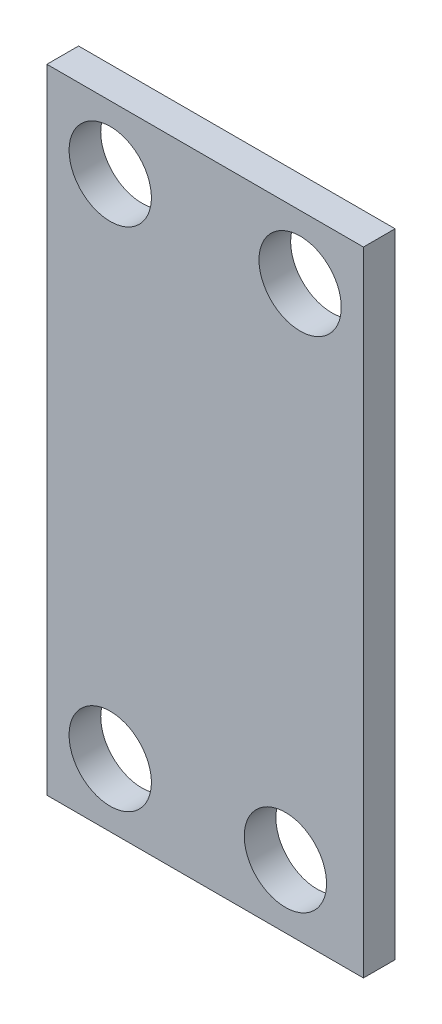
ISO-10303-21;
HEADER;
FILE_DESCRIPTION(('STEP AP214'),'2;1');
FILE_NAME('part.step','',(''),(''),'','','');
FILE_SCHEMA(('AUTOMOTIVE_DESIGN { 1 0 10303 214 1 1 1 1 }'));
ENDSEC;
DATA;
#1=APPLICATION_CONTEXT('core data for automotive mechanical design processes');
#2=APPLICATION_PROTOCOL_DEFINITION('international standard','automotive_design',2000,#1);
#3=PRODUCT_CONTEXT('',#1,'mechanical');
#4=PRODUCT('Part','Part','',(#3));
#5=PRODUCT_RELATED_PRODUCT_CATEGORY('part','',(#4));
#6=PRODUCT_DEFINITION_FORMATION('','',#4);
#7=PRODUCT_DEFINITION_CONTEXT('part definition',#1,'design');
#8=PRODUCT_DEFINITION('design','',#6,#7);
#9=PRODUCT_DEFINITION_SHAPE('','',#8);
#10=(LENGTH_UNIT() NAMED_UNIT(*) SI_UNIT(.MILLI.,.METRE.));
#11=(NAMED_UNIT(*) PLANE_ANGLE_UNIT() SI_UNIT($,.RADIAN.));
#12=(NAMED_UNIT(*) SI_UNIT($,.STERADIAN.) SOLID_ANGLE_UNIT());
#13=UNCERTAINTY_MEASURE_WITH_UNIT(LENGTH_MEASURE(1.E-05),#10,'distance_accuracy_value','');
#14=(GEOMETRIC_REPRESENTATION_CONTEXT(3) GLOBAL_UNCERTAINTY_ASSIGNED_CONTEXT((#13)) GLOBAL_UNIT_ASSIGNED_CONTEXT((#10,
#11,#12)) REPRESENTATION_CONTEXT('',''));
#15=CARTESIAN_POINT('',(0.,0.,0.));
#16=DIRECTION('',(0.,0.,1.));
#17=DIRECTION('',(1.,0.,0.));
#18=AXIS2_PLACEMENT_3D('',#15,#16,#17);
#19=CARTESIAN_POINT('',(0.,0.,5.));
#20=DIRECTION('',(1.,0.,0.));
#21=DIRECTION('',(0.,1.,0.));
#22=AXIS2_PLACEMENT_3D('',#19,#20,#21);
#23=PLANE('',#22);
#24=DIRECTION('',(0.,-1.,0.));
#25=VECTOR('',#24,1.);
#26=CARTESIAN_POINT('',(0.,0.,0.));
#27=LINE('',#26,#25);
#28=CARTESIAN_POINT('',(0.,0.,0.));
#29=VERTEX_POINT('',#28);
#30=CARTESIAN_POINT('',(0.,-100.,0.));
#31=VERTEX_POINT('',#30);
#32=EDGE_CURVE('E96',#29,#31,#27,.T.);
#33=ORIENTED_EDGE('',*,*,#32,.T.);
#34=DIRECTION('',(0.,0.,-1.));
#35=VECTOR('',#34,1.);
#36=CARTESIAN_POINT('',(0.,-100.,5.));
#37=LINE('',#36,#35);
#38=CARTESIAN_POINT('',(0.,-100.,5.));
#39=VERTEX_POINT('',#38);
#40=EDGE_CURVE('E11',#39,#31,#37,.T.);
#41=ORIENTED_EDGE('',*,*,#40,.F.);
#42=DIRECTION('',(0.,-1.,0.));
#43=VECTOR('',#42,1.);
#44=CARTESIAN_POINT('',(0.,0.,5.));
#45=LINE('',#44,#43);
#46=CARTESIAN_POINT('',(0.,0.,5.));
#47=VERTEX_POINT('',#46);
#48=EDGE_CURVE('E84',#47,#39,#45,.T.);
#49=ORIENTED_EDGE('',*,*,#48,.F.);
#50=DIRECTION('',(0.,0.,-1.));
#51=VECTOR('',#50,1.);
#52=CARTESIAN_POINT('',(0.,0.,5.));
#53=LINE('',#52,#51);
#54=EDGE_CURVE('E92',#47,#29,#53,.T.);
#55=ORIENTED_EDGE('',*,*,#54,.T.);
#56=EDGE_LOOP('',(#33,#41,#49,#55));
#57=FACE_BOUND('',#56,.T.);
#58=ADVANCED_FACE('F33',(#57),#23,.F.);
#59=CARTESIAN_POINT('',(0.,-100.,5.));
#60=DIRECTION('',(0.,1.,0.));
#61=DIRECTION('',(0.,0.,1.));
#62=AXIS2_PLACEMENT_3D('',#59,#60,#61);
#63=PLANE('',#62);
#64=DIRECTION('',(1.,0.,0.));
#65=VECTOR('',#64,1.);
#66=CARTESIAN_POINT('',(0.,-100.,0.));
#67=LINE('',#66,#65);
#68=CARTESIAN_POINT('',(50.,-100.,0.));
#69=VERTEX_POINT('',#68);
#70=EDGE_CURVE('E88',#31,#69,#67,.T.);
#71=ORIENTED_EDGE('',*,*,#70,.T.);
#72=DIRECTION('',(0.,0.,-1.));
#73=VECTOR('',#72,1.);
#74=CARTESIAN_POINT('',(50.,-100.,5.));
#75=LINE('',#74,#73);
#76=CARTESIAN_POINT('',(50.,-100.,5.));
#77=VERTEX_POINT('',#76);
#78=EDGE_CURVE('E41',#77,#69,#75,.T.);
#79=ORIENTED_EDGE('',*,*,#78,.F.);
#80=DIRECTION('',(1.,0.,0.));
#81=VECTOR('',#80,1.);
#82=CARTESIAN_POINT('',(0.,-100.,5.));
#83=LINE('',#82,#81);
#84=EDGE_CURVE('E79',#39,#77,#83,.T.);
#85=ORIENTED_EDGE('',*,*,#84,.F.);
#86=ORIENTED_EDGE('',*,*,#40,.T.);
#87=EDGE_LOOP('',(#71,#79,#85,#86));
#88=FACE_BOUND('',#87,.T.);
#89=ADVANCED_FACE('F87',(#88),#63,.F.);
#90=CARTESIAN_POINT('',(50.,0.,5.));
#91=DIRECTION('',(-1.,0.,0.));
#92=DIRECTION('',(0.,-1.,0.));
#93=AXIS2_PLACEMENT_3D('',#90,#91,#92);
#94=PLANE('',#93);
#95=DIRECTION('',(0.,1.,0.));
#96=VECTOR('',#95,1.);
#97=CARTESIAN_POINT('',(50.,0.,0.));
#98=LINE('',#97,#96);
#99=CARTESIAN_POINT('',(50.,0.,0.));
#100=VERTEX_POINT('',#99);
#101=EDGE_CURVE('E66',#69,#100,#98,.T.);
#102=ORIENTED_EDGE('',*,*,#101,.T.);
#103=DIRECTION('',(0.,0.,-1.));
#104=VECTOR('',#103,1.);
#105=CARTESIAN_POINT('',(50.,0.,5.));
#106=LINE('',#105,#104);
#107=CARTESIAN_POINT('',(50.,0.,5.));
#108=VERTEX_POINT('',#107);
#109=EDGE_CURVE('E89',#108,#100,#106,.T.);
#110=ORIENTED_EDGE('',*,*,#109,.F.);
#111=DIRECTION('',(0.,1.,0.));
#112=VECTOR('',#111,1.);
#113=CARTESIAN_POINT('',(50.,0.,5.));
#114=LINE('',#113,#112);
#115=EDGE_CURVE('E82',#77,#108,#114,.T.);
#116=ORIENTED_EDGE('',*,*,#115,.F.);
#117=ORIENTED_EDGE('',*,*,#78,.T.);
#118=EDGE_LOOP('',(#102,#110,#116,#117));
#119=FACE_BOUND('',#118,.T.);
#120=ADVANCED_FACE('F90',(#119),#94,.F.);
#121=CARTESIAN_POINT('',(0.,0.,5.));
#122=DIRECTION('',(0.,-1.,0.));
#123=DIRECTION('',(0.,0.,-1.));
#124=AXIS2_PLACEMENT_3D('',#121,#122,#123);
#125=PLANE('',#124);
#126=DIRECTION('',(-1.,0.,0.));
#127=VECTOR('',#126,1.);
#128=CARTESIAN_POINT('',(0.,0.,0.));
#129=LINE('',#128,#127);
#130=EDGE_CURVE('E72',#100,#29,#129,.T.);
#131=ORIENTED_EDGE('',*,*,#130,.T.);
#132=ORIENTED_EDGE('',*,*,#54,.F.);
#133=DIRECTION('',(-1.,0.,0.));
#134=VECTOR('',#133,1.);
#135=CARTESIAN_POINT('',(0.,0.,5.));
#136=LINE('',#135,#134);
#137=EDGE_CURVE('E49',#108,#47,#136,.T.);
#138=ORIENTED_EDGE('',*,*,#137,.F.);
#139=ORIENTED_EDGE('',*,*,#109,.T.);
#140=EDGE_LOOP('',(#131,#132,#138,#139));
#141=FACE_BOUND('',#140,.T.);
#142=ADVANCED_FACE('F104',(#141),#125,.F.);
#143=CARTESIAN_POINT('',(0.,0.,5.));
#144=DIRECTION('',(0.,0.,1.));
#145=DIRECTION('',(1.,0.,0.));
#146=AXIS2_PLACEMENT_3D('',#143,#144,#145);
#147=PLANE('',#146);
#148=CARTESIAN_POINT('',(37.6746410474057,-90.,5.));
#149=DIRECTION('',(0.,0.,-1.));
#150=DIRECTION('',(-1.,0.,0.));
#151=AXIS2_PLACEMENT_3D('',#148,#149,#150);
#152=CIRCLE('',#151,6.5);
#153=CARTESIAN_POINT('',(31.1746410474057,-90.,5.));
#154=VERTEX_POINT('',#153);
#155=EDGE_CURVE('E125',#154,#154,#152,.T.);
#156=ORIENTED_EDGE('',*,*,#155,.T.);
#157=EDGE_LOOP('',(#156));
#158=FACE_BOUND('',#157,.T.);
#159=CARTESIAN_POINT('',(10.,-90.,5.));
#160=DIRECTION('',(0.,0.,-1.));
#161=DIRECTION('',(-1.,0.,0.));
#162=AXIS2_PLACEMENT_3D('',#159,#160,#161);
#163=CIRCLE('',#162,6.50000000000001);
#164=CARTESIAN_POINT('',(3.5,-90.,5.));
#165=VERTEX_POINT('',#164);
#166=EDGE_CURVE('E119',#165,#165,#163,.T.);
#167=ORIENTED_EDGE('',*,*,#166,.T.);
#168=EDGE_LOOP('',(#167));
#169=FACE_BOUND('',#168,.T.);
#170=CARTESIAN_POINT('',(40.,-10.,5.));
#171=DIRECTION('',(0.,0.,-1.));
#172=DIRECTION('',(-1.,0.,0.));
#173=AXIS2_PLACEMENT_3D('',#170,#171,#172);
#174=CIRCLE('',#173,6.5);
#175=CARTESIAN_POINT('',(33.5,-10.,5.));
#176=VERTEX_POINT('',#175);
#177=EDGE_CURVE('E113',#176,#176,#174,.T.);
#178=ORIENTED_EDGE('',*,*,#177,.T.);
#179=EDGE_LOOP('',(#178));
#180=FACE_BOUND('',#179,.T.);
#181=CARTESIAN_POINT('',(10.,-10.,5.));
#182=DIRECTION('',(0.,0.,-1.));
#183=DIRECTION('',(-1.,0.,0.));
#184=AXIS2_PLACEMENT_3D('',#181,#182,#183);
#185=CIRCLE('',#184,6.5);
#186=CARTESIAN_POINT('',(3.5,-10.,5.));
#187=VERTEX_POINT('',#186);
#188=EDGE_CURVE('E99',#187,#187,#185,.T.);
#189=ORIENTED_EDGE('',*,*,#188,.T.);
#190=EDGE_LOOP('',(#189));
#191=FACE_BOUND('',#190,.T.);
#192=ORIENTED_EDGE('',*,*,#48,.T.);
#193=ORIENTED_EDGE('',*,*,#84,.T.);
#194=ORIENTED_EDGE('',*,*,#115,.T.);
#195=ORIENTED_EDGE('',*,*,#137,.T.);
#196=EDGE_LOOP('',(#192,#193,#194,#195));
#197=FACE_BOUND('',#196,.T.);
#198=ADVANCED_FACE('F80',(#158,#169,#180,#191,#197),#147,.T.);
#199=CARTESIAN_POINT('',(0.,0.,0.));
#200=DIRECTION('',(0.,0.,1.));
#201=DIRECTION('',(1.,0.,0.));
#202=AXIS2_PLACEMENT_3D('',#199,#200,#201);
#203=PLANE('',#202);
#204=CARTESIAN_POINT('',(37.6746410474057,-90.,0.));
#205=DIRECTION('',(0.,0.,-1.));
#206=DIRECTION('',(-1.,0.,0.));
#207=AXIS2_PLACEMENT_3D('',#204,#205,#206);
#208=CIRCLE('',#207,6.5);
#209=CARTESIAN_POINT('',(31.1746410474057,-90.,0.));
#210=VERTEX_POINT('',#209);
#211=EDGE_CURVE('E128',#210,#210,#208,.T.);
#212=ORIENTED_EDGE('',*,*,#211,.F.);
#213=EDGE_LOOP('',(#212));
#214=FACE_BOUND('',#213,.T.);
#215=CARTESIAN_POINT('',(10.,-90.,0.));
#216=DIRECTION('',(0.,0.,-1.));
#217=DIRECTION('',(-1.,0.,0.));
#218=AXIS2_PLACEMENT_3D('',#215,#216,#217);
#219=CIRCLE('',#218,6.50000000000001);
#220=CARTESIAN_POINT('',(3.5,-90.,0.));
#221=VERTEX_POINT('',#220);
#222=EDGE_CURVE('E122',#221,#221,#219,.T.);
#223=ORIENTED_EDGE('',*,*,#222,.F.);
#224=EDGE_LOOP('',(#223));
#225=FACE_BOUND('',#224,.T.);
#226=CARTESIAN_POINT('',(40.,-10.,0.));
#227=DIRECTION('',(0.,0.,-1.));
#228=DIRECTION('',(-1.,0.,0.));
#229=AXIS2_PLACEMENT_3D('',#226,#227,#228);
#230=CIRCLE('',#229,6.5);
#231=CARTESIAN_POINT('',(33.5,-10.,0.));
#232=VERTEX_POINT('',#231);
#233=EDGE_CURVE('E116',#232,#232,#230,.T.);
#234=ORIENTED_EDGE('',*,*,#233,.F.);
#235=EDGE_LOOP('',(#234));
#236=FACE_BOUND('',#235,.T.);
#237=CARTESIAN_POINT('',(10.,-10.,0.));
#238=DIRECTION('',(0.,0.,-1.));
#239=DIRECTION('',(-1.,0.,0.));
#240=AXIS2_PLACEMENT_3D('',#237,#238,#239);
#241=CIRCLE('',#240,6.5);
#242=CARTESIAN_POINT('',(3.5,-10.,0.));
#243=VERTEX_POINT('',#242);
#244=EDGE_CURVE('E110',#243,#243,#241,.T.);
#245=ORIENTED_EDGE('',*,*,#244,.F.);
#246=EDGE_LOOP('',(#245));
#247=FACE_BOUND('',#246,.T.);
#248=ORIENTED_EDGE('',*,*,#32,.F.);
#249=ORIENTED_EDGE('',*,*,#130,.F.);
#250=ORIENTED_EDGE('',*,*,#101,.F.);
#251=ORIENTED_EDGE('',*,*,#70,.F.);
#252=EDGE_LOOP('',(#248,#249,#250,#251));
#253=FACE_BOUND('',#252,.T.);
#254=ADVANCED_FACE('F107',(#214,#225,#236,#247,#253),#203,.F.);
#255=CARTESIAN_POINT('',(10.,-10.,5.));
#256=DIRECTION('',(0.,0.,-1.));
#257=DIRECTION('',(-1.,0.,0.));
#258=AXIS2_PLACEMENT_3D('',#255,#256,#257);
#259=CYLINDRICAL_SURFACE('',#258,6.5);
#260=ORIENTED_EDGE('',*,*,#188,.F.);
#261=EDGE_LOOP('',(#260));
#262=FACE_BOUND('',#261,.T.);
#263=ORIENTED_EDGE('',*,*,#244,.T.);
#264=EDGE_LOOP('',(#263));
#265=FACE_BOUND('',#264,.T.);
#266=ADVANCED_FACE('F145',(#262,#265),#259,.F.);
#267=CARTESIAN_POINT('',(40.,-10.,5.));
#268=DIRECTION('',(0.,0.,-1.));
#269=DIRECTION('',(-1.,0.,0.));
#270=AXIS2_PLACEMENT_3D('',#267,#268,#269);
#271=CYLINDRICAL_SURFACE('',#270,6.5);
#272=ORIENTED_EDGE('',*,*,#177,.F.);
#273=EDGE_LOOP('',(#272));
#274=FACE_BOUND('',#273,.T.);
#275=ORIENTED_EDGE('',*,*,#233,.T.);
#276=EDGE_LOOP('',(#275));
#277=FACE_BOUND('',#276,.T.);
#278=ADVANCED_FACE('F154',(#274,#277),#271,.F.);
#279=CARTESIAN_POINT('',(10.,-90.,5.));
#280=DIRECTION('',(0.,0.,-1.));
#281=DIRECTION('',(-1.,0.,0.));
#282=AXIS2_PLACEMENT_3D('',#279,#280,#281);
#283=CYLINDRICAL_SURFACE('',#282,6.50000000000001);
#284=ORIENTED_EDGE('',*,*,#166,.F.);
#285=EDGE_LOOP('',(#284));
#286=FACE_BOUND('',#285,.T.);
#287=ORIENTED_EDGE('',*,*,#222,.T.);
#288=EDGE_LOOP('',(#287));
#289=FACE_BOUND('',#288,.T.);
#290=ADVANCED_FACE('F139',(#286,#289),#283,.F.);
#291=CARTESIAN_POINT('',(37.6746410474057,-90.,5.));
#292=DIRECTION('',(0.,0.,-1.));
#293=DIRECTION('',(-1.,0.,0.));
#294=AXIS2_PLACEMENT_3D('',#291,#292,#293);
#295=CYLINDRICAL_SURFACE('',#294,6.5);
#296=ORIENTED_EDGE('',*,*,#155,.F.);
#297=EDGE_LOOP('',(#296));
#298=FACE_BOUND('',#297,.T.);
#299=ORIENTED_EDGE('',*,*,#211,.T.);
#300=EDGE_LOOP('',(#299));
#301=FACE_BOUND('',#300,.T.);
#302=ADVANCED_FACE('F136',(#298,#301),#295,.F.);
#303=CLOSED_SHELL('',(#58,#89,#120,#142,#198,#254,#266,#278,#290,#302));
#304=MANIFOLD_SOLID_BREP('B2',#303);
#305=ADVANCED_BREP_SHAPE_REPRESENTATION('',(#18,#304),#14);
#306=SHAPE_DEFINITION_REPRESENTATION(#9,#305);
ENDSEC;
END-ISO-10303-21;
